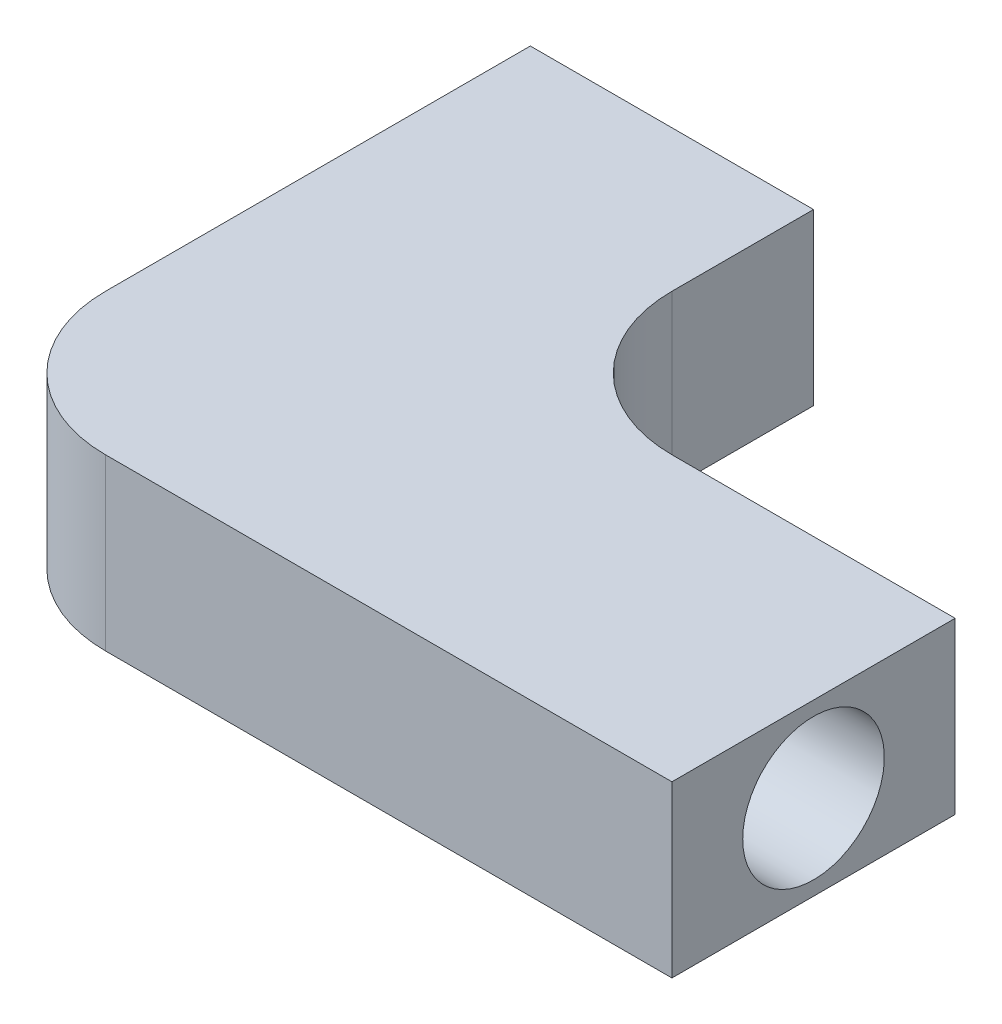
ISO-10303-21;
HEADER;
FILE_DESCRIPTION(('STEP AP214'),'2;1');
FILE_NAME('part.step','',(''),(''),'','','');
FILE_SCHEMA(('AUTOMOTIVE_DESIGN { 1 0 10303 214 1 1 1 1 }'));
ENDSEC;
DATA;
#1=APPLICATION_CONTEXT('core data for automotive mechanical design processes');
#2=APPLICATION_PROTOCOL_DEFINITION('international standard','automotive_design',2000,#1);
#3=PRODUCT_CONTEXT('',#1,'mechanical');
#4=PRODUCT('Part','Part','',(#3));
#5=PRODUCT_RELATED_PRODUCT_CATEGORY('part','',(#4));
#6=PRODUCT_DEFINITION_FORMATION('','',#4);
#7=PRODUCT_DEFINITION_CONTEXT('part definition',#1,'design');
#8=PRODUCT_DEFINITION('design','',#6,#7);
#9=PRODUCT_DEFINITION_SHAPE('','',#8);
#10=(LENGTH_UNIT() NAMED_UNIT(*) SI_UNIT(.MILLI.,.METRE.));
#11=(NAMED_UNIT(*) PLANE_ANGLE_UNIT() SI_UNIT($,.RADIAN.));
#12=(NAMED_UNIT(*) SI_UNIT($,.STERADIAN.) SOLID_ANGLE_UNIT());
#13=UNCERTAINTY_MEASURE_WITH_UNIT(LENGTH_MEASURE(1.E-05),#10,'distance_accuracy_value','');
#14=(GEOMETRIC_REPRESENTATION_CONTEXT(3) GLOBAL_UNCERTAINTY_ASSIGNED_CONTEXT((#13)) GLOBAL_UNIT_ASSIGNED_CONTEXT((#10,
#11,#12)) REPRESENTATION_CONTEXT('',''));
#15=CARTESIAN_POINT('',(0.,0.,0.));
#16=DIRECTION('',(0.,0.,1.));
#17=DIRECTION('',(1.,0.,0.));
#18=AXIS2_PLACEMENT_3D('',#15,#16,#17);
#19=CARTESIAN_POINT('',(20.,12.,0.));
#20=DIRECTION('',(0.,0.,1.));
#21=DIRECTION('',(1.,0.,0.));
#22=AXIS2_PLACEMENT_3D('',#19,#20,#21);
#23=PLANE('',#22);
#24=CARTESIAN_POINT('',(10.,6.,0.));
#25=DIRECTION('',(0.,0.,1.));
#26=DIRECTION('',(1.,0.,0.));
#27=AXIS2_PLACEMENT_3D('',#24,#25,#26);
#28=CIRCLE('',#27,5.);
#29=CARTESIAN_POINT('',(15.,6.,0.));
#30=VERTEX_POINT('',#29);
#31=EDGE_CURVE('E43',#30,#30,#28,.F.);
#32=ORIENTED_EDGE('',*,*,#31,.F.);
#33=EDGE_LOOP('',(#32));
#34=FACE_BOUND('',#33,.T.);
#35=DIRECTION('',(-1.,0.,0.));
#36=VECTOR('',#35,1.);
#37=CARTESIAN_POINT('',(20.,0.,0.));
#38=LINE('',#37,#36);
#39=CARTESIAN_POINT('',(20.,0.,0.));
#40=VERTEX_POINT('',#39);
#41=CARTESIAN_POINT('',(0.,0.,0.));
#42=VERTEX_POINT('',#41);
#43=EDGE_CURVE('E128',#40,#42,#38,.T.);
#44=ORIENTED_EDGE('',*,*,#43,.T.);
#45=DIRECTION('',(0.,-1.,0.));
#46=VECTOR('',#45,1.);
#47=CARTESIAN_POINT('',(0.,12.,0.));
#48=LINE('',#47,#46);
#49=CARTESIAN_POINT('',(0.,12.,0.));
#50=VERTEX_POINT('',#49);
#51=EDGE_CURVE('E111',#50,#42,#48,.T.);
#52=ORIENTED_EDGE('',*,*,#51,.F.);
#53=DIRECTION('',(-1.,0.,0.));
#54=VECTOR('',#53,1.);
#55=CARTESIAN_POINT('',(20.,12.,0.));
#56=LINE('',#55,#54);
#57=CARTESIAN_POINT('',(20.,12.,0.));
#58=VERTEX_POINT('',#57);
#59=EDGE_CURVE('E117',#58,#50,#56,.T.);
#60=ORIENTED_EDGE('',*,*,#59,.F.);
#61=DIRECTION('',(0.,-1.,0.));
#62=VECTOR('',#61,1.);
#63=CARTESIAN_POINT('',(20.,12.,0.));
#64=LINE('',#63,#62);
#65=EDGE_CURVE('E168',#58,#40,#64,.T.);
#66=ORIENTED_EDGE('',*,*,#65,.T.);
#67=EDGE_LOOP('',(#44,#52,#60,#66));
#68=FACE_BOUND('',#67,.T.);
#69=ADVANCED_FACE('F39',(#34,#68),#23,.F.);
#70=CARTESIAN_POINT('',(0.,12.,0.));
#71=DIRECTION('',(1.,0.,0.));
#72=DIRECTION('',(0.,0.,-1.));
#73=AXIS2_PLACEMENT_3D('',#70,#71,#72);
#74=PLANE('',#73);
#75=DIRECTION('',(0.,0.,1.));
#76=VECTOR('',#75,1.);
#77=CARTESIAN_POINT('',(0.,0.,0.));
#78=LINE('',#77,#76);
#79=CARTESIAN_POINT('',(0.,0.,30.));
#80=VERTEX_POINT('',#79);
#81=EDGE_CURVE('E170',#42,#80,#78,.T.);
#82=ORIENTED_EDGE('',*,*,#81,.T.);
#83=DIRECTION('',(0.,-1.,0.));
#84=VECTOR('',#83,1.);
#85=CARTESIAN_POINT('',(0.,12.,30.));
#86=LINE('',#85,#84);
#87=CARTESIAN_POINT('',(0.,12.,30.));
#88=VERTEX_POINT('',#87);
#89=EDGE_CURVE('E114',#80,#88,#86,.F.);
#90=ORIENTED_EDGE('',*,*,#89,.T.);
#91=DIRECTION('',(0.,0.,1.));
#92=VECTOR('',#91,1.);
#93=CARTESIAN_POINT('',(0.,12.,0.));
#94=LINE('',#93,#92);
#95=EDGE_CURVE('E106',#50,#88,#94,.T.);
#96=ORIENTED_EDGE('',*,*,#95,.F.);
#97=ORIENTED_EDGE('',*,*,#51,.T.);
#98=EDGE_LOOP('',(#82,#90,#96,#97));
#99=FACE_BOUND('',#98,.T.);
#100=ADVANCED_FACE('F109',(#99),#74,.F.);
#101=CARTESIAN_POINT('',(0.,12.,40.));
#102=DIRECTION('',(0.,0.,-1.));
#103=DIRECTION('',(-1.,0.,0.));
#104=AXIS2_PLACEMENT_3D('',#101,#102,#103);
#105=PLANE('',#104);
#106=DIRECTION('',(1.,0.,0.));
#107=VECTOR('',#106,1.);
#108=CARTESIAN_POINT('',(0.,12.,40.));
#109=LINE('',#108,#107);
#110=CARTESIAN_POINT('',(10.,12.,40.));
#111=VERTEX_POINT('',#110);
#112=CARTESIAN_POINT('',(50.,12.,40.));
#113=VERTEX_POINT('',#112);
#114=EDGE_CURVE('E116',#111,#113,#109,.T.);
#115=ORIENTED_EDGE('',*,*,#114,.F.);
#116=DIRECTION('',(0.,-1.,0.));
#117=VECTOR('',#116,1.);
#118=CARTESIAN_POINT('',(10.,12.,40.));
#119=LINE('',#118,#117);
#120=CARTESIAN_POINT('',(10.,0.,40.));
#121=VERTEX_POINT('',#120);
#122=EDGE_CURVE('E129',#111,#121,#119,.T.);
#123=ORIENTED_EDGE('',*,*,#122,.T.);
#124=DIRECTION('',(1.,0.,0.));
#125=VECTOR('',#124,1.);
#126=CARTESIAN_POINT('',(0.,0.,40.));
#127=LINE('',#126,#125);
#128=CARTESIAN_POINT('',(50.,0.,40.));
#129=VERTEX_POINT('',#128);
#130=EDGE_CURVE('E172',#121,#129,#127,.T.);
#131=ORIENTED_EDGE('',*,*,#130,.T.);
#132=DIRECTION('',(0.,-1.,0.));
#133=VECTOR('',#132,1.);
#134=CARTESIAN_POINT('',(50.,12.,40.));
#135=LINE('',#134,#133);
#136=EDGE_CURVE('E130',#113,#129,#135,.T.);
#137=ORIENTED_EDGE('',*,*,#136,.F.);
#138=EDGE_LOOP('',(#115,#123,#131,#137));
#139=FACE_BOUND('',#138,.T.);
#140=ADVANCED_FACE('F200',(#139),#105,.F.);
#141=CARTESIAN_POINT('',(50.,12.,40.));
#142=DIRECTION('',(-1.,0.,0.));
#143=DIRECTION('',(0.,0.,1.));
#144=AXIS2_PLACEMENT_3D('',#141,#142,#143);
#145=PLANE('',#144);
#146=CARTESIAN_POINT('',(50.,6.,30.));
#147=DIRECTION('',(-1.,0.,0.));
#148=DIRECTION('',(0.,0.,1.));
#149=AXIS2_PLACEMENT_3D('',#146,#147,#148);
#150=CIRCLE('',#149,5.);
#151=CARTESIAN_POINT('',(50.,6.,35.));
#152=VERTEX_POINT('',#151);
#153=EDGE_CURVE('E148',#152,#152,#150,.F.);
#154=ORIENTED_EDGE('',*,*,#153,.F.);
#155=EDGE_LOOP('',(#154));
#156=FACE_BOUND('',#155,.T.);
#157=DIRECTION('',(0.,0.,-1.));
#158=VECTOR('',#157,1.);
#159=CARTESIAN_POINT('',(50.,0.,40.));
#160=LINE('',#159,#158);
#161=CARTESIAN_POINT('',(50.,0.,20.));
#162=VERTEX_POINT('',#161);
#163=EDGE_CURVE('E174',#129,#162,#160,.T.);
#164=ORIENTED_EDGE('',*,*,#163,.T.);
#165=DIRECTION('',(0.,-1.,0.));
#166=VECTOR('',#165,1.);
#167=CARTESIAN_POINT('',(50.,12.,20.));
#168=LINE('',#167,#166);
#169=CARTESIAN_POINT('',(50.,12.,20.));
#170=VERTEX_POINT('',#169);
#171=EDGE_CURVE('E136',#170,#162,#168,.T.);
#172=ORIENTED_EDGE('',*,*,#171,.F.);
#173=DIRECTION('',(0.,0.,-1.));
#174=VECTOR('',#173,1.);
#175=CARTESIAN_POINT('',(50.,12.,40.));
#176=LINE('',#175,#174);
#177=EDGE_CURVE('E163',#113,#170,#176,.T.);
#178=ORIENTED_EDGE('',*,*,#177,.F.);
#179=ORIENTED_EDGE('',*,*,#136,.T.);
#180=EDGE_LOOP('',(#164,#172,#178,#179));
#181=FACE_BOUND('',#180,.T.);
#182=ADVANCED_FACE('F201',(#156,#181),#145,.F.);
#183=CARTESIAN_POINT('',(50.,12.,20.));
#184=DIRECTION('',(0.,0.,1.));
#185=DIRECTION('',(1.,0.,0.));
#186=AXIS2_PLACEMENT_3D('',#183,#184,#185);
#187=PLANE('',#186);
#188=DIRECTION('',(-1.,0.,0.));
#189=VECTOR('',#188,1.);
#190=CARTESIAN_POINT('',(50.,0.,20.));
#191=LINE('',#190,#189);
#192=CARTESIAN_POINT('',(30.,0.,20.));
#193=VERTEX_POINT('',#192);
#194=EDGE_CURVE('E176',#162,#193,#191,.T.);
#195=ORIENTED_EDGE('',*,*,#194,.T.);
#196=DIRECTION('',(0.,-1.,0.));
#197=VECTOR('',#196,1.);
#198=CARTESIAN_POINT('',(30.,12.,20.));
#199=LINE('',#198,#197);
#200=CARTESIAN_POINT('',(30.,12.,20.));
#201=VERTEX_POINT('',#200);
#202=EDGE_CURVE('E62',#193,#201,#199,.F.);
#203=ORIENTED_EDGE('',*,*,#202,.T.);
#204=DIRECTION('',(-1.,0.,0.));
#205=VECTOR('',#204,1.);
#206=CARTESIAN_POINT('',(50.,12.,20.));
#207=LINE('',#206,#205);
#208=EDGE_CURVE('E165',#170,#201,#207,.T.);
#209=ORIENTED_EDGE('',*,*,#208,.F.);
#210=ORIENTED_EDGE('',*,*,#171,.T.);
#211=EDGE_LOOP('',(#195,#203,#209,#210));
#212=FACE_BOUND('',#211,.T.);
#213=ADVANCED_FACE('F182',(#212),#187,.F.);
#214=CARTESIAN_POINT('',(20.,12.,20.));
#215=DIRECTION('',(-1.,0.,0.));
#216=DIRECTION('',(0.,0.,1.));
#217=AXIS2_PLACEMENT_3D('',#214,#215,#216);
#218=PLANE('',#217);
#219=DIRECTION('',(0.,0.,-1.));
#220=VECTOR('',#219,1.);
#221=CARTESIAN_POINT('',(20.,12.,20.));
#222=LINE('',#221,#220);
#223=CARTESIAN_POINT('',(20.,12.,10.));
#224=VERTEX_POINT('',#223);
#225=EDGE_CURVE('E121',#224,#58,#222,.T.);
#226=ORIENTED_EDGE('',*,*,#225,.F.);
#227=DIRECTION('',(0.,-1.,0.));
#228=VECTOR('',#227,1.);
#229=CARTESIAN_POINT('',(20.,0.,10.));
#230=LINE('',#229,#228);
#231=CARTESIAN_POINT('',(20.,0.,10.));
#232=VERTEX_POINT('',#231);
#233=EDGE_CURVE('E144',#224,#232,#230,.T.);
#234=ORIENTED_EDGE('',*,*,#233,.T.);
#235=DIRECTION('',(0.,0.,-1.));
#236=VECTOR('',#235,1.);
#237=CARTESIAN_POINT('',(20.,0.,20.));
#238=LINE('',#237,#236);
#239=EDGE_CURVE('E125',#232,#40,#238,.T.);
#240=ORIENTED_EDGE('',*,*,#239,.T.);
#241=ORIENTED_EDGE('',*,*,#65,.F.);
#242=EDGE_LOOP('',(#226,#234,#240,#241));
#243=FACE_BOUND('',#242,.T.);
#244=ADVANCED_FACE('F193',(#243),#218,.F.);
#245=CARTESIAN_POINT('',(0.,12.,0.));
#246=DIRECTION('',(0.,1.,0.));
#247=DIRECTION('',(0.,0.,1.));
#248=AXIS2_PLACEMENT_3D('',#245,#246,#247);
#249=PLANE('',#248);
#250=ORIENTED_EDGE('',*,*,#95,.T.);
#251=CARTESIAN_POINT('',(10.,12.,30.));
#252=DIRECTION('',(0.,1.,0.));
#253=DIRECTION('',(0.,0.,1.));
#254=AXIS2_PLACEMENT_3D('',#251,#252,#253);
#255=CIRCLE('',#254,10.);
#256=EDGE_CURVE('E142',#88,#111,#255,.T.);
#257=ORIENTED_EDGE('',*,*,#256,.T.);
#258=ORIENTED_EDGE('',*,*,#114,.T.);
#259=ORIENTED_EDGE('',*,*,#177,.T.);
#260=ORIENTED_EDGE('',*,*,#208,.T.);
#261=CARTESIAN_POINT('',(30.,12.,10.));
#262=DIRECTION('',(0.,1.,0.));
#263=DIRECTION('',(0.,0.,1.));
#264=AXIS2_PLACEMENT_3D('',#261,#262,#263);
#265=CIRCLE('',#264,10.);
#266=EDGE_CURVE('E11',#201,#224,#265,.F.);
#267=ORIENTED_EDGE('',*,*,#266,.T.);
#268=ORIENTED_EDGE('',*,*,#225,.T.);
#269=ORIENTED_EDGE('',*,*,#59,.T.);
#270=EDGE_LOOP('',(#250,#257,#258,#259,#260,#267,#268,#269));
#271=FACE_BOUND('',#270,.T.);
#272=ADVANCED_FACE('F120',(#271),#249,.T.);
#273=CARTESIAN_POINT('',(0.,0.,0.));
#274=DIRECTION('',(0.,1.,0.));
#275=DIRECTION('',(0.,0.,1.));
#276=AXIS2_PLACEMENT_3D('',#273,#274,#275);
#277=PLANE('',#276);
#278=ORIENTED_EDGE('',*,*,#130,.F.);
#279=CARTESIAN_POINT('',(10.,0.,30.));
#280=DIRECTION('',(0.,1.,0.));
#281=DIRECTION('',(0.,0.,1.));
#282=AXIS2_PLACEMENT_3D('',#279,#280,#281);
#283=CIRCLE('',#282,10.);
#284=EDGE_CURVE('E133',#121,#80,#283,.F.);
#285=ORIENTED_EDGE('',*,*,#284,.T.);
#286=ORIENTED_EDGE('',*,*,#81,.F.);
#287=ORIENTED_EDGE('',*,*,#43,.F.);
#288=ORIENTED_EDGE('',*,*,#239,.F.);
#289=CARTESIAN_POINT('',(30.,0.,10.));
#290=DIRECTION('',(0.,1.,0.));
#291=DIRECTION('',(0.,0.,1.));
#292=AXIS2_PLACEMENT_3D('',#289,#290,#291);
#293=CIRCLE('',#292,10.);
#294=EDGE_CURVE('E48',#232,#193,#293,.T.);
#295=ORIENTED_EDGE('',*,*,#294,.T.);
#296=ORIENTED_EDGE('',*,*,#194,.F.);
#297=ORIENTED_EDGE('',*,*,#163,.F.);
#298=EDGE_LOOP('',(#278,#285,#286,#287,#288,#295,#296,#297));
#299=FACE_BOUND('',#298,.T.);
#300=ADVANCED_FACE('F188',(#299),#277,.F.);
#301=CARTESIAN_POINT('',(10.,12.,30.));
#302=DIRECTION('',(0.,-1.,0.));
#303=DIRECTION('',(0.,0.,-1.));
#304=AXIS2_PLACEMENT_3D('',#301,#302,#303);
#305=CYLINDRICAL_SURFACE('',#304,10.);
#306=ORIENTED_EDGE('',*,*,#256,.F.);
#307=ORIENTED_EDGE('',*,*,#89,.F.);
#308=ORIENTED_EDGE('',*,*,#284,.F.);
#309=ORIENTED_EDGE('',*,*,#122,.F.);
#310=EDGE_LOOP('',(#306,#307,#308,#309));
#311=FACE_BOUND('',#310,.T.);
#312=ADVANCED_FACE('F195',(#311),#305,.T.);
#313=CARTESIAN_POINT('',(30.,12.,10.));
#314=DIRECTION('',(0.,1.,0.));
#315=DIRECTION('',(0.,0.,1.));
#316=AXIS2_PLACEMENT_3D('',#313,#314,#315);
#317=CYLINDRICAL_SURFACE('',#316,10.);
#318=ORIENTED_EDGE('',*,*,#266,.F.);
#319=ORIENTED_EDGE('',*,*,#202,.F.);
#320=ORIENTED_EDGE('',*,*,#294,.F.);
#321=ORIENTED_EDGE('',*,*,#233,.F.);
#322=EDGE_LOOP('',(#318,#319,#320,#321));
#323=FACE_BOUND('',#322,.T.);
#324=ADVANCED_FACE('F41',(#323),#317,.F.);
#325=CARTESIAN_POINT('',(10.,6.,-3.27051534160948));
#326=DIRECTION('',(0.,0.,1.));
#327=DIRECTION('',(1.,0.,0.));
#328=AXIS2_PLACEMENT_3D('',#325,#326,#327);
#329=CYLINDRICAL_SURFACE('',#328,5.);
#330=CARTESIAN_POINT('',(10.,6.,20.));
#331=DIRECTION('',(0.,0.,-1.));
#332=DIRECTION('',(-1.,0.,0.));
#333=AXIS2_PLACEMENT_3D('',#330,#331,#332);
#334=CIRCLE('',#333,5.);
#335=CARTESIAN_POINT('',(5.,6.,20.));
#336=VERTEX_POINT('',#335);
#337=EDGE_CURVE('E155',#336,#336,#334,.T.);
#338=ORIENTED_EDGE('',*,*,#337,.F.);
#339=EDGE_LOOP('',(#338));
#340=FACE_BOUND('',#339,.T.);
#341=ORIENTED_EDGE('',*,*,#31,.T.);
#342=EDGE_LOOP('',(#341));
#343=FACE_BOUND('',#342,.T.);
#344=ADVANCED_FACE('F224',(#340,#343),#329,.F.);
#345=CARTESIAN_POINT('',(20.,6.,30.));
#346=DIRECTION('',(1.,0.,0.));
#347=DIRECTION('',(0.,0.,-1.));
#348=AXIS2_PLACEMENT_3D('',#345,#346,#347);
#349=CYLINDRICAL_SURFACE('',#348,5.);
#350=CARTESIAN_POINT('',(20.,6.,30.));
#351=DIRECTION('',(-1.,0.,0.));
#352=DIRECTION('',(0.,0.,1.));
#353=AXIS2_PLACEMENT_3D('',#350,#351,#352);
#354=CIRCLE('',#353,5.);
#355=CARTESIAN_POINT('',(20.,6.,35.));
#356=VERTEX_POINT('',#355);
#357=EDGE_CURVE('E150',#356,#356,#354,.T.);
#358=ORIENTED_EDGE('',*,*,#357,.T.);
#359=EDGE_LOOP('',(#358));
#360=FACE_BOUND('',#359,.T.);
#361=ORIENTED_EDGE('',*,*,#153,.T.);
#362=EDGE_LOOP('',(#361));
#363=FACE_BOUND('',#362,.T.);
#364=ADVANCED_FACE('F281',(#360,#363),#349,.F.);
#365=CARTESIAN_POINT('',(20.,6.,20.));
#366=DIRECTION('',(0.,1.,0.));
#367=DIRECTION('',(0.,0.,1.));
#368=AXIS2_PLACEMENT_3D('',#365,#366,#367);
#369=TOROIDAL_SURFACE('',#368,10.,5.);
#370=CARTESIAN_POINT('',(20.,6.,20.));
#371=DIRECTION('',(0.,1.,0.));
#372=DIRECTION('',(0.,0.,1.));
#373=AXIS2_PLACEMENT_3D('',#370,#371,#372);
#374=CIRCLE('',#373,15.);
#375=EDGE_CURVE('',#336,#356,#374,.T.);
#376=ORIENTED_EDGE('',*,*,#337,.T.);
#377=ORIENTED_EDGE('',*,*,#357,.F.);
#378=ORIENTED_EDGE('',*,*,#375,.T.);
#379=ORIENTED_EDGE('',*,*,#375,.F.);
#380=EDGE_LOOP('',(#376,#378,#377,#379));
#381=FACE_BOUND('',#380,.T.);
#382=ADVANCED_FACE('F292',(#381),#369,.F.);
#383=CLOSED_SHELL('',(#69,#100,#140,#182,#213,#244,#272,#300,#312,#324,#344,#364,#382));
#384=MANIFOLD_SOLID_BREP('B2',#383);
#385=ADVANCED_BREP_SHAPE_REPRESENTATION('',(#18,#384),#14);
#386=SHAPE_DEFINITION_REPRESENTATION(#9,#385);
ENDSEC;
END-ISO-10303-21;
